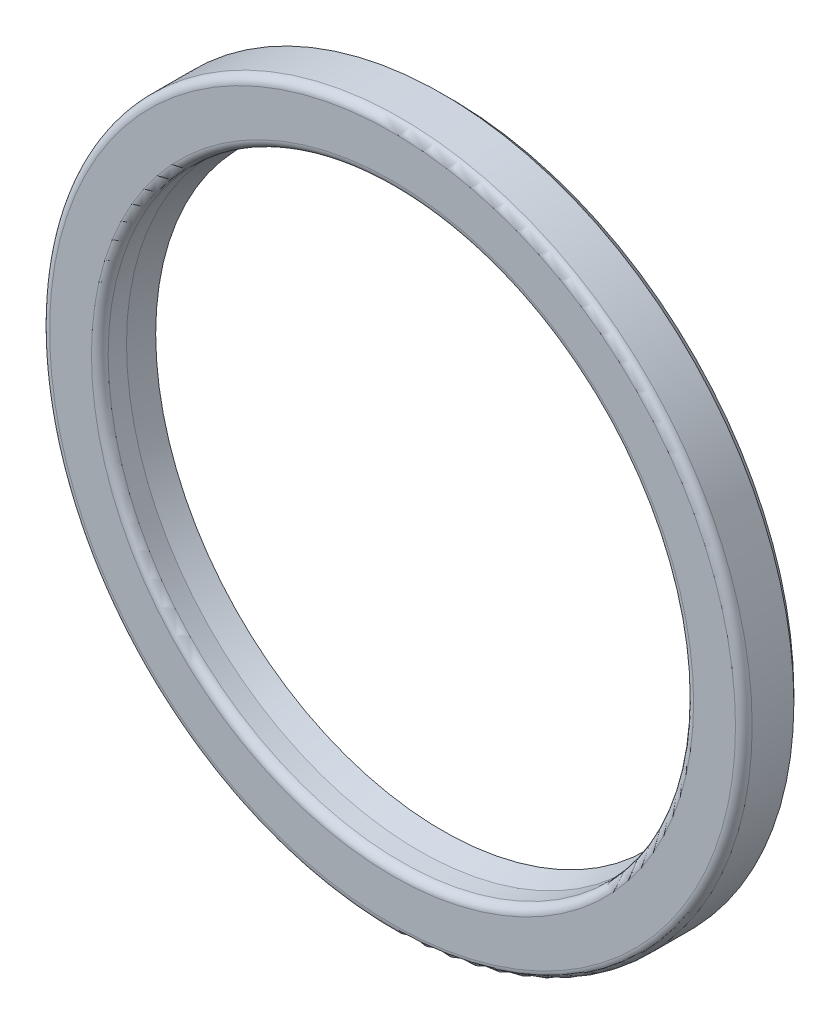
ISO-10303-21;
HEADER;
FILE_DESCRIPTION(('STEP AP214'),'2;1');
FILE_NAME('part.step','',(''),(''),'','','');
FILE_SCHEMA(('AUTOMOTIVE_DESIGN { 1 0 10303 214 1 1 1 1 }'));
ENDSEC;
DATA;
#1=APPLICATION_CONTEXT('core data for automotive mechanical design processes');
#2=APPLICATION_PROTOCOL_DEFINITION('international standard','automotive_design',2000,#1);
#3=PRODUCT_CONTEXT('',#1,'mechanical');
#4=PRODUCT('Part','Part','',(#3));
#5=PRODUCT_RELATED_PRODUCT_CATEGORY('part','',(#4));
#6=PRODUCT_DEFINITION_FORMATION('','',#4);
#7=PRODUCT_DEFINITION_CONTEXT('part definition',#1,'design');
#8=PRODUCT_DEFINITION('design','',#6,#7);
#9=PRODUCT_DEFINITION_SHAPE('','',#8);
#10=(LENGTH_UNIT() NAMED_UNIT(*) SI_UNIT(.MILLI.,.METRE.));
#11=(NAMED_UNIT(*) PLANE_ANGLE_UNIT() SI_UNIT($,.RADIAN.));
#12=(NAMED_UNIT(*) SI_UNIT($,.STERADIAN.) SOLID_ANGLE_UNIT());
#13=UNCERTAINTY_MEASURE_WITH_UNIT(LENGTH_MEASURE(1.E-05),#10,'distance_accuracy_value','');
#14=(GEOMETRIC_REPRESENTATION_CONTEXT(3) GLOBAL_UNCERTAINTY_ASSIGNED_CONTEXT((#13)) GLOBAL_UNIT_ASSIGNED_CONTEXT((#10,
#11,#12)) REPRESENTATION_CONTEXT('',''));
#15=CARTESIAN_POINT('',(0.,0.,0.));
#16=DIRECTION('',(0.,0.,1.));
#17=DIRECTION('',(1.,0.,0.));
#18=AXIS2_PLACEMENT_3D('',#15,#16,#17);
#19=CARTESIAN_POINT('',(0.,0.,-3.5));
#20=DIRECTION('',(0.,0.,1.));
#21=DIRECTION('',(1.,0.,0.));
#22=AXIS2_PLACEMENT_3D('',#19,#20,#21);
#23=CONICAL_SURFACE('',#22,20.56,0.785398163397449);
#24=CARTESIAN_POINT('',(0.,0.,-3.));
#25=DIRECTION('',(0.,0.,1.));
#26=DIRECTION('',(1.,0.,0.));
#27=AXIS2_PLACEMENT_3D('',#24,#25,#26);
#28=CIRCLE('',#27,21.06);
#29=CARTESIAN_POINT('',(21.06,0.,-3.));
#30=VERTEX_POINT('',#29);
#31=EDGE_CURVE('E88',#30,#30,#28,.T.);
#32=ORIENTED_EDGE('',*,*,#31,.F.);
#33=EDGE_LOOP('',(#32));
#34=FACE_BOUND('',#33,.T.);
#35=CARTESIAN_POINT('',(0.,0.,-3.5));
#36=DIRECTION('',(0.,0.,1.));
#37=DIRECTION('',(1.,0.,0.));
#38=AXIS2_PLACEMENT_3D('',#35,#36,#37);
#39=CIRCLE('',#38,20.56);
#40=CARTESIAN_POINT('',(20.56,0.,-3.5));
#41=VERTEX_POINT('',#40);
#42=EDGE_CURVE('E10',#41,#41,#39,.T.);
#43=ORIENTED_EDGE('',*,*,#42,.T.);
#44=EDGE_LOOP('',(#43));
#45=FACE_BOUND('',#44,.T.);
#46=ADVANCED_FACE('F45',(#34,#45),#23,.T.);
#47=CARTESIAN_POINT('',(0.,20.56,-3.5));
#48=DIRECTION('',(0.,0.,1.));
#49=DIRECTION('',(1.,0.,0.));
#50=AXIS2_PLACEMENT_3D('',#47,#48,#49);
#51=PLANE('',#50);
#52=ORIENTED_EDGE('',*,*,#42,.F.);
#53=EDGE_LOOP('',(#52));
#54=FACE_BOUND('',#53,.T.);
#55=CARTESIAN_POINT('',(0.,0.,-3.5));
#56=DIRECTION('',(0.,0.,1.));
#57=DIRECTION('',(1.,0.,0.));
#58=AXIS2_PLACEMENT_3D('',#55,#56,#57);
#59=CIRCLE('',#58,20.4);
#60=CARTESIAN_POINT('',(20.4,0.,-3.5));
#61=VERTEX_POINT('',#60);
#62=EDGE_CURVE('E51',#61,#61,#59,.T.);
#63=ORIENTED_EDGE('',*,*,#62,.T.);
#64=EDGE_LOOP('',(#63));
#65=FACE_BOUND('',#64,.T.);
#66=ADVANCED_FACE('F95',(#54,#65),#51,.F.);
#67=CARTESIAN_POINT('',(0.,0.,0.));
#68=DIRECTION('',(0.,0.,1.));
#69=DIRECTION('',(1.,0.,0.));
#70=AXIS2_PLACEMENT_3D('',#67,#68,#69);
#71=CYLINDRICAL_SURFACE('',#70,20.4);
#72=ORIENTED_EDGE('',*,*,#62,.F.);
#73=EDGE_LOOP('',(#72));
#74=FACE_BOUND('',#73,.T.);
#75=CARTESIAN_POINT('',(0.,0.,-0.5));
#76=DIRECTION('',(0.,0.,1.));
#77=DIRECTION('',(1.,0.,0.));
#78=AXIS2_PLACEMENT_3D('',#75,#76,#77);
#79=CIRCLE('',#78,20.4);
#80=CARTESIAN_POINT('',(20.4,0.,-0.5));
#81=VERTEX_POINT('',#80);
#82=EDGE_CURVE('E55',#81,#81,#79,.T.);
#83=ORIENTED_EDGE('',*,*,#82,.T.);
#84=EDGE_LOOP('',(#83));
#85=FACE_BOUND('',#84,.T.);
#86=ADVANCED_FACE('F99',(#74,#85),#71,.F.);
#87=CARTESIAN_POINT('',(0.,19.4,-0.5));
#88=DIRECTION('',(0.,0.,1.));
#89=DIRECTION('',(1.,0.,0.));
#90=AXIS2_PLACEMENT_3D('',#87,#88,#89);
#91=PLANE('',#90);
#92=ORIENTED_EDGE('',*,*,#82,.F.);
#93=EDGE_LOOP('',(#92));
#94=FACE_BOUND('',#93,.T.);
#95=CARTESIAN_POINT('',(0.,0.,-0.5));
#96=DIRECTION('',(0.,0.,1.));
#97=DIRECTION('',(1.,0.,0.));
#98=AXIS2_PLACEMENT_3D('',#95,#96,#97);
#99=CIRCLE('',#98,19.4);
#100=CARTESIAN_POINT('',(19.4,0.,-0.5));
#101=VERTEX_POINT('',#100);
#102=EDGE_CURVE('E59',#101,#101,#99,.T.);
#103=ORIENTED_EDGE('',*,*,#102,.T.);
#104=EDGE_LOOP('',(#103));
#105=FACE_BOUND('',#104,.T.);
#106=ADVANCED_FACE('F105',(#94,#105),#91,.F.);
#107=CARTESIAN_POINT('',(0.,0.,-3.5));
#108=DIRECTION('',(0.,0.,1.));
#109=DIRECTION('',(1.,0.,0.));
#110=AXIS2_PLACEMENT_3D('',#107,#108,#109);
#111=CONICAL_SURFACE('',#110,18.3,0.351444794003551);
#112=ORIENTED_EDGE('',*,*,#102,.F.);
#113=EDGE_LOOP('',(#112));
#114=FACE_BOUND('',#113,.T.);
#115=CARTESIAN_POINT('',(0.,0.,-3.5));
#116=DIRECTION('',(0.,0.,1.));
#117=DIRECTION('',(1.,0.,0.));
#118=AXIS2_PLACEMENT_3D('',#115,#116,#117);
#119=CIRCLE('',#118,18.3);
#120=CARTESIAN_POINT('',(18.3,0.,-3.5));
#121=VERTEX_POINT('',#120);
#122=EDGE_CURVE('E64',#121,#121,#119,.T.);
#123=ORIENTED_EDGE('',*,*,#122,.T.);
#124=EDGE_LOOP('',(#123));
#125=FACE_BOUND('',#124,.T.);
#126=ADVANCED_FACE('F111',(#114,#125),#111,.T.);
#127=CARTESIAN_POINT('',(0.,18.3,-3.5));
#128=DIRECTION('',(0.,0.,1.));
#129=DIRECTION('',(1.,0.,0.));
#130=AXIS2_PLACEMENT_3D('',#127,#128,#129);
#131=PLANE('',#130);
#132=ORIENTED_EDGE('',*,*,#122,.F.);
#133=EDGE_LOOP('',(#132));
#134=FACE_BOUND('',#133,.T.);
#135=CARTESIAN_POINT('',(0.,0.,-3.5));
#136=DIRECTION('',(0.,0.,1.));
#137=DIRECTION('',(1.,0.,0.));
#138=AXIS2_PLACEMENT_3D('',#135,#136,#137);
#139=CIRCLE('',#138,18.);
#140=CARTESIAN_POINT('',(18.,0.,-3.5));
#141=VERTEX_POINT('',#140);
#142=EDGE_CURVE('E67',#141,#141,#139,.T.);
#143=ORIENTED_EDGE('',*,*,#142,.T.);
#144=EDGE_LOOP('',(#143));
#145=FACE_BOUND('',#144,.T.);
#146=ADVANCED_FACE('F115',(#134,#145),#131,.F.);
#147=CARTESIAN_POINT('',(0.,0.,-3.00000000000001));
#148=DIRECTION('',(0.,0.,-1.));
#149=DIRECTION('',(-1.,0.,0.));
#150=AXIS2_PLACEMENT_3D('',#147,#148,#149);
#151=CONICAL_SURFACE('',#150,17.2,1.01219701145134);
#152=ORIENTED_EDGE('',*,*,#142,.F.);
#153=EDGE_LOOP('',(#152));
#154=FACE_BOUND('',#153,.T.);
#155=CARTESIAN_POINT('',(0.,0.,-3.00000000000001));
#156=DIRECTION('',(0.,0.,1.));
#157=DIRECTION('',(1.,0.,0.));
#158=AXIS2_PLACEMENT_3D('',#155,#156,#157);
#159=CIRCLE('',#158,17.2);
#160=CARTESIAN_POINT('',(17.2,0.,-3.00000000000001));
#161=VERTEX_POINT('',#160);
#162=EDGE_CURVE('E70',#161,#161,#159,.T.);
#163=ORIENTED_EDGE('',*,*,#162,.T.);
#164=EDGE_LOOP('',(#163));
#165=FACE_BOUND('',#164,.T.);
#166=ADVANCED_FACE('F119',(#154,#165),#151,.F.);
#167=CARTESIAN_POINT('',(0.,0.,-1.6));
#168=DIRECTION('',(0.,0.,1.));
#169=DIRECTION('',(1.,0.,0.));
#170=AXIS2_PLACEMENT_3D('',#167,#168,#169);
#171=CONICAL_SURFACE('',#170,17.55,0.244978663126863);
#172=ORIENTED_EDGE('',*,*,#162,.F.);
#173=EDGE_LOOP('',(#172));
#174=FACE_BOUND('',#173,.T.);
#175=CARTESIAN_POINT('',(0.,0.,-1.6));
#176=DIRECTION('',(0.,0.,1.));
#177=DIRECTION('',(1.,0.,0.));
#178=AXIS2_PLACEMENT_3D('',#175,#176,#177);
#179=CIRCLE('',#178,17.55);
#180=CARTESIAN_POINT('',(17.55,0.,-1.6));
#181=VERTEX_POINT('',#180);
#182=EDGE_CURVE('E73',#181,#181,#179,.T.);
#183=ORIENTED_EDGE('',*,*,#182,.T.);
#184=EDGE_LOOP('',(#183));
#185=FACE_BOUND('',#184,.T.);
#186=ADVANCED_FACE('F123',(#174,#185),#171,.F.);
#187=CARTESIAN_POINT('',(0.,0.,0.));
#188=DIRECTION('',(0.,0.,1.));
#189=DIRECTION('',(1.,0.,0.));
#190=AXIS2_PLACEMENT_3D('',#187,#188,#189);
#191=CYLINDRICAL_SURFACE('',#190,17.55);
#192=ORIENTED_EDGE('',*,*,#182,.F.);
#193=EDGE_LOOP('',(#192));
#194=FACE_BOUND('',#193,.T.);
#195=CARTESIAN_POINT('',(0.,0.,-0.5));
#196=DIRECTION('',(0.,0.,1.));
#197=DIRECTION('',(1.,0.,0.));
#198=AXIS2_PLACEMENT_3D('',#195,#196,#197);
#199=CIRCLE('',#198,17.55);
#200=CARTESIAN_POINT('',(17.55,0.,-0.5));
#201=VERTEX_POINT('',#200);
#202=EDGE_CURVE('E76',#201,#201,#199,.T.);
#203=ORIENTED_EDGE('',*,*,#202,.T.);
#204=EDGE_LOOP('',(#203));
#205=FACE_BOUND('',#204,.T.);
#206=ADVANCED_FACE('F127',(#194,#205),#191,.F.);
#207=CARTESIAN_POINT('',(0.,0.,-0.5));
#208=DIRECTION('',(0.,0.,1.));
#209=DIRECTION('',(1.,0.,0.));
#210=AXIS2_PLACEMENT_3D('',#207,#208,#209);
#211=TOROIDAL_SURFACE('',#210,18.05,0.5);
#212=ORIENTED_EDGE('',*,*,#202,.F.);
#213=EDGE_LOOP('',(#212));
#214=FACE_BOUND('',#213,.T.);
#215=CARTESIAN_POINT('',(0.,0.,0.));
#216=DIRECTION('',(0.,0.,1.));
#217=DIRECTION('',(1.,0.,0.));
#218=AXIS2_PLACEMENT_3D('',#215,#216,#217);
#219=CIRCLE('',#218,18.05);
#220=CARTESIAN_POINT('',(18.05,0.,0.));
#221=VERTEX_POINT('',#220);
#222=EDGE_CURVE('E79',#221,#221,#219,.T.);
#223=ORIENTED_EDGE('',*,*,#222,.T.);
#224=EDGE_LOOP('',(#223));
#225=FACE_BOUND('',#224,.T.);
#226=ADVANCED_FACE('F131',(#214,#225),#211,.T.);
#227=CARTESIAN_POINT('',(0.,18.05,0.));
#228=DIRECTION('',(0.,0.,-1.));
#229=DIRECTION('',(-1.,0.,0.));
#230=AXIS2_PLACEMENT_3D('',#227,#228,#229);
#231=PLANE('',#230);
#232=ORIENTED_EDGE('',*,*,#222,.F.);
#233=EDGE_LOOP('',(#232));
#234=FACE_BOUND('',#233,.T.);
#235=CARTESIAN_POINT('',(0.,0.,0.));
#236=DIRECTION('',(0.,0.,1.));
#237=DIRECTION('',(1.,0.,0.));
#238=AXIS2_PLACEMENT_3D('',#235,#236,#237);
#239=CIRCLE('',#238,20.56);
#240=CARTESIAN_POINT('',(20.56,0.,0.));
#241=VERTEX_POINT('',#240);
#242=EDGE_CURVE('E82',#241,#241,#239,.T.);
#243=ORIENTED_EDGE('',*,*,#242,.T.);
#244=EDGE_LOOP('',(#243));
#245=FACE_BOUND('',#244,.T.);
#246=ADVANCED_FACE('F135',(#234,#245),#231,.F.);
#247=CARTESIAN_POINT('',(0.,0.,-0.5));
#248=DIRECTION('',(0.,0.,1.));
#249=DIRECTION('',(1.,0.,0.));
#250=AXIS2_PLACEMENT_3D('',#247,#248,#249);
#251=TOROIDAL_SURFACE('',#250,20.56,0.5);
#252=ORIENTED_EDGE('',*,*,#242,.F.);
#253=EDGE_LOOP('',(#252));
#254=FACE_BOUND('',#253,.T.);
#255=CARTESIAN_POINT('',(0.,0.,-0.5));
#256=DIRECTION('',(0.,0.,1.));
#257=DIRECTION('',(1.,0.,0.));
#258=AXIS2_PLACEMENT_3D('',#255,#256,#257);
#259=CIRCLE('',#258,21.06);
#260=CARTESIAN_POINT('',(21.06,0.,-0.5));
#261=VERTEX_POINT('',#260);
#262=EDGE_CURVE('E85',#261,#261,#259,.T.);
#263=ORIENTED_EDGE('',*,*,#262,.T.);
#264=EDGE_LOOP('',(#263));
#265=FACE_BOUND('',#264,.T.);
#266=ADVANCED_FACE('F139',(#254,#265),#251,.T.);
#267=CARTESIAN_POINT('',(0.,0.,0.));
#268=DIRECTION('',(0.,0.,1.));
#269=DIRECTION('',(1.,0.,0.));
#270=AXIS2_PLACEMENT_3D('',#267,#268,#269);
#271=CYLINDRICAL_SURFACE('',#270,21.06);
#272=ORIENTED_EDGE('',*,*,#262,.F.);
#273=EDGE_LOOP('',(#272));
#274=FACE_BOUND('',#273,.T.);
#275=ORIENTED_EDGE('',*,*,#31,.T.);
#276=EDGE_LOOP('',(#275));
#277=FACE_BOUND('',#276,.T.);
#278=ADVANCED_FACE('F92',(#274,#277),#271,.T.);
#279=CLOSED_SHELL('',(#46,#66,#86,#106,#126,#146,#166,#186,#206,#226,#246,#266,#278));
#280=MANIFOLD_SOLID_BREP('B2',#279);
#281=ADVANCED_BREP_SHAPE_REPRESENTATION('',(#18,#280),#14);
#282=SHAPE_DEFINITION_REPRESENTATION(#9,#281);
ENDSEC;
END-ISO-10303-21;
